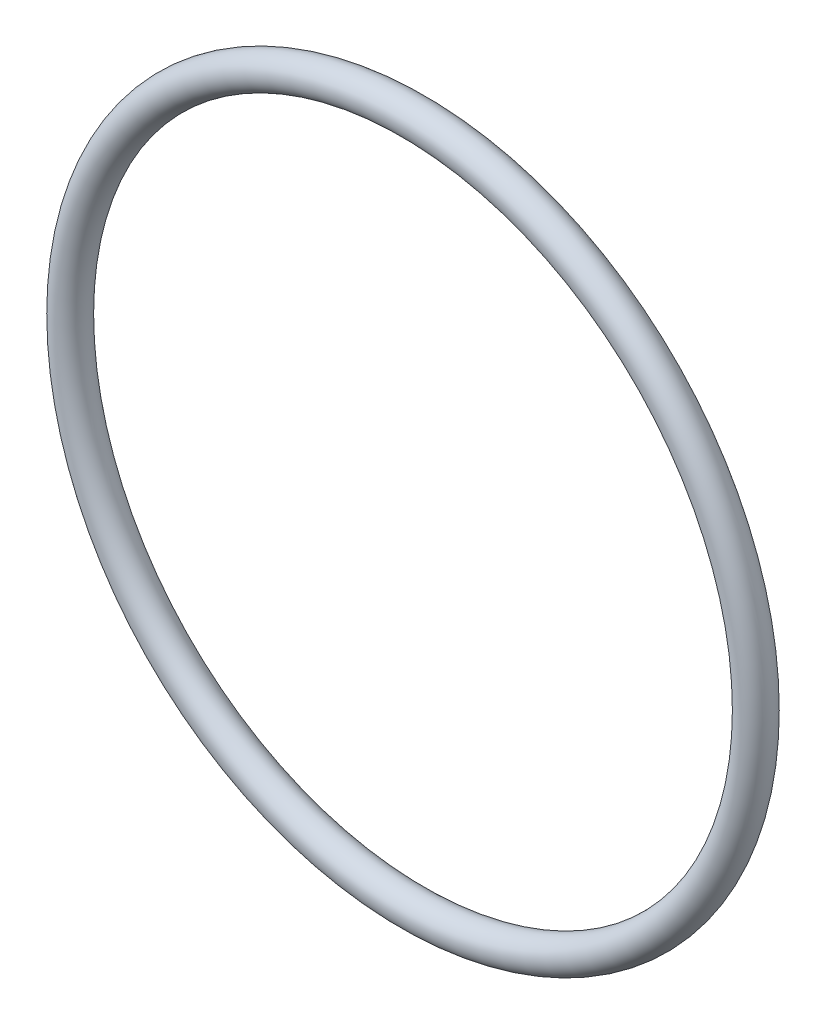
ISO-10303-21;
HEADER;
FILE_DESCRIPTION(('STEP AP214'),'2;1');
FILE_NAME('part.step','',(''),(''),'','','');
FILE_SCHEMA(('AUTOMOTIVE_DESIGN { 1 0 10303 214 1 1 1 1 }'));
ENDSEC;
DATA;
#1=APPLICATION_CONTEXT('core data for automotive mechanical design processes');
#2=APPLICATION_PROTOCOL_DEFINITION('international standard','automotive_design',2000,#1);
#3=PRODUCT_CONTEXT('',#1,'mechanical');
#4=PRODUCT('Part','Part','',(#3));
#5=PRODUCT_RELATED_PRODUCT_CATEGORY('part','',(#4));
#6=PRODUCT_DEFINITION_FORMATION('','',#4);
#7=PRODUCT_DEFINITION_CONTEXT('part definition',#1,'design');
#8=PRODUCT_DEFINITION('design','',#6,#7);
#9=PRODUCT_DEFINITION_SHAPE('','',#8);
#10=(LENGTH_UNIT() NAMED_UNIT(*) SI_UNIT(.MILLI.,.METRE.));
#11=(NAMED_UNIT(*) PLANE_ANGLE_UNIT() SI_UNIT($,.RADIAN.));
#12=(NAMED_UNIT(*) SI_UNIT($,.STERADIAN.) SOLID_ANGLE_UNIT());
#13=UNCERTAINTY_MEASURE_WITH_UNIT(LENGTH_MEASURE(1.E-05),#10,'distance_accuracy_value','');
#14=(GEOMETRIC_REPRESENTATION_CONTEXT(3) GLOBAL_UNCERTAINTY_ASSIGNED_CONTEXT((#13)) GLOBAL_UNIT_ASSIGNED_CONTEXT((#10,
#11,#12)) REPRESENTATION_CONTEXT('',''));
#15=CARTESIAN_POINT('',(0.,0.,0.));
#16=DIRECTION('',(0.,0.,1.));
#17=DIRECTION('',(1.,0.,0.));
#18=AXIS2_PLACEMENT_3D('',#15,#16,#17);
#19=CARTESIAN_POINT('',(0.,0.,0.));
#20=DIRECTION('',(0.,0.,1.));
#21=DIRECTION('',(1.,0.,0.));
#22=AXIS2_PLACEMENT_3D('',#19,#20,#21);
#23=TOROIDAL_SURFACE('',#22,36.4871,1.76530000000001);
#24=CARTESIAN_POINT('',(38.2524,0.,0.));
#25=VERTEX_POINT('',#24);
#26=VERTEX_LOOP('',#25);
#27=FACE_BOUND('',#26,.T.);
#28=ADVANCED_FACE('F35',(#27),#23,.T.);
#29=CLOSED_SHELL('',(#28));
#30=MANIFOLD_SOLID_BREP('B2',#29);
#31=ADVANCED_BREP_SHAPE_REPRESENTATION('',(#18,#30),#14);
#32=SHAPE_DEFINITION_REPRESENTATION(#9,#31);
ENDSEC;
END-ISO-10303-21;
